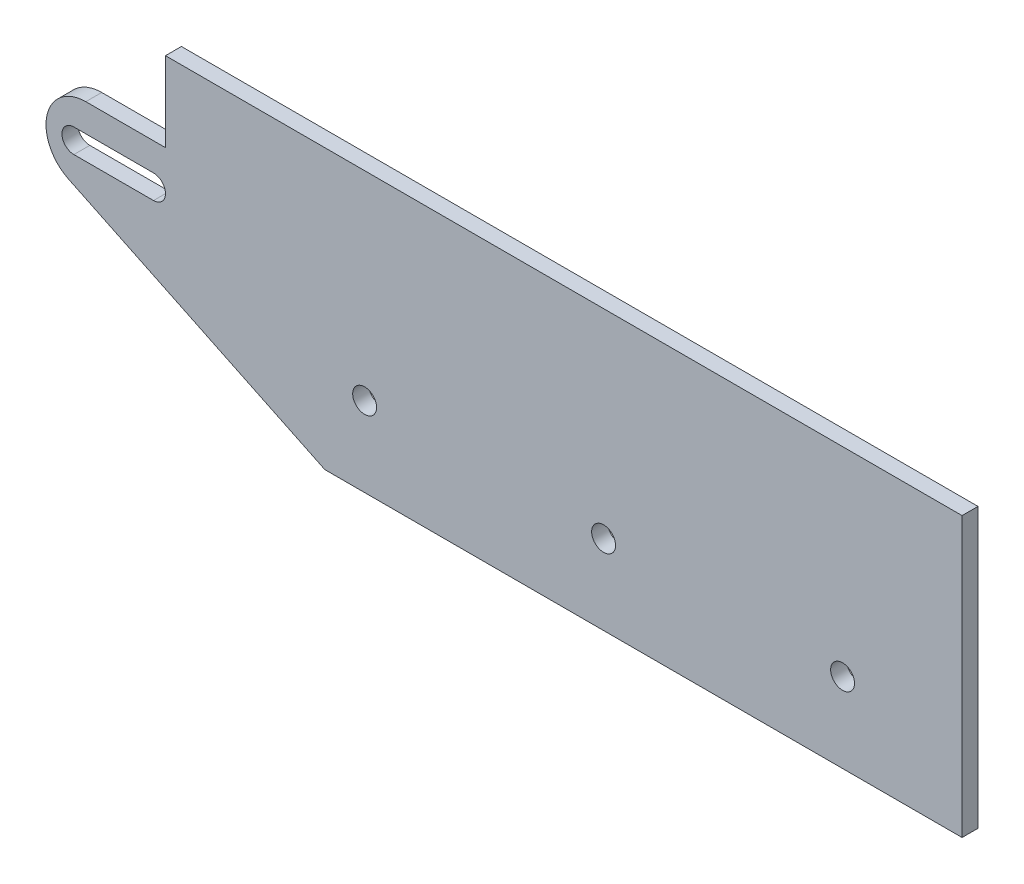
ISO-10303-21;
HEADER;
FILE_DESCRIPTION(('STEP AP214'),'2;1');
FILE_NAME('part.step','',(''),(''),'','','');
FILE_SCHEMA(('AUTOMOTIVE_DESIGN { 1 0 10303 214 1 1 1 1 }'));
ENDSEC;
DATA;
#1=APPLICATION_CONTEXT('core data for automotive mechanical design processes');
#2=APPLICATION_PROTOCOL_DEFINITION('international standard','automotive_design',2000,#1);
#3=PRODUCT_CONTEXT('',#1,'mechanical');
#4=PRODUCT('Part','Part','',(#3));
#5=PRODUCT_RELATED_PRODUCT_CATEGORY('part','',(#4));
#6=PRODUCT_DEFINITION_FORMATION('','',#4);
#7=PRODUCT_DEFINITION_CONTEXT('part definition',#1,'design');
#8=PRODUCT_DEFINITION('design','',#6,#7);
#9=PRODUCT_DEFINITION_SHAPE('','',#8);
#10=(LENGTH_UNIT() NAMED_UNIT(*) SI_UNIT(.MILLI.,.METRE.));
#11=(NAMED_UNIT(*) PLANE_ANGLE_UNIT() SI_UNIT($,.RADIAN.));
#12=(NAMED_UNIT(*) SI_UNIT($,.STERADIAN.) SOLID_ANGLE_UNIT());
#13=UNCERTAINTY_MEASURE_WITH_UNIT(LENGTH_MEASURE(1.E-05),#10,'distance_accuracy_value','');
#14=(GEOMETRIC_REPRESENTATION_CONTEXT(3) GLOBAL_UNCERTAINTY_ASSIGNED_CONTEXT((#13)) GLOBAL_UNIT_ASSIGNED_CONTEXT((#10,
#11,#12)) REPRESENTATION_CONTEXT('',''));
#15=CARTESIAN_POINT('',(0.,0.,0.));
#16=DIRECTION('',(0.,0.,1.));
#17=DIRECTION('',(1.,0.,0.));
#18=AXIS2_PLACEMENT_3D('',#15,#16,#17);
#19=CARTESIAN_POINT('',(-12.4914360624661,-25.9334108072672,2.));
#20=DIRECTION('',(-0.433956032964835,-0.900934049447252,0.));
#21=DIRECTION('',(0.900934049447252,-0.433956032964835,0.));
#22=AXIS2_PLACEMENT_3D('',#19,#20,#21);
#23=PLANE('',#22);
#24=DIRECTION('',(-0.900934049447252,0.433956032964835,0.));
#25=VECTOR('',#24,1.);
#26=CARTESIAN_POINT('',(-12.4914360624661,-25.9334108072672,0.));
#27=LINE('',#26,#25);
#28=CARTESIAN_POINT('',(-29.9999999999997,-17.5000000000002,0.));
#29=VERTEX_POINT('',#28);
#30=CARTESIAN_POINT('',(-62.1697801648241,-2.00467024723637,0.));
#31=VERTEX_POINT('',#30);
#32=EDGE_CURVE('E165',#29,#31,#27,.T.);
#33=ORIENTED_EDGE('',*,*,#32,.F.);
#34=DIRECTION('',(0.,0.,-1.));
#35=VECTOR('',#34,1.);
#36=CARTESIAN_POINT('',(-29.9999999999997,-17.5000000000002,2.));
#37=LINE('',#36,#35);
#38=CARTESIAN_POINT('',(-29.9999999999997,-17.5000000000002,2.));
#39=VERTEX_POINT('',#38);
#40=EDGE_CURVE('E11',#39,#29,#37,.T.);
#41=ORIENTED_EDGE('',*,*,#40,.F.);
#42=DIRECTION('',(-0.900934049447252,0.433956032964835,0.));
#43=VECTOR('',#42,1.);
#44=CARTESIAN_POINT('',(-12.4914360624661,-25.9334108072672,2.));
#45=LINE('',#44,#43);
#46=CARTESIAN_POINT('',(-62.1697801648241,-2.00467024723637,2.));
#47=VERTEX_POINT('',#46);
#48=EDGE_CURVE('E194',#39,#47,#45,.T.);
#49=ORIENTED_EDGE('',*,*,#48,.T.);
#50=DIRECTION('',(0.,0.,-1.));
#51=VECTOR('',#50,1.);
#52=CARTESIAN_POINT('',(-62.1697801648241,-2.00467024723637,2.));
#53=LINE('',#52,#51);
#54=EDGE_CURVE('E219',#47,#31,#53,.T.);
#55=ORIENTED_EDGE('',*,*,#54,.T.);
#56=EDGE_LOOP('',(#33,#41,#49,#55));
#57=FACE_BOUND('',#56,.T.);
#58=ADVANCED_FACE('F39',(#57),#23,.T.);
#59=CARTESIAN_POINT('',(0.,-17.5000000000002,2.));
#60=DIRECTION('',(0.,-1.,0.));
#61=DIRECTION('',(1.,0.,0.));
#62=AXIS2_PLACEMENT_3D('',#59,#60,#61);
#63=PLANE('',#62);
#64=DIRECTION('',(-1.,0.,0.));
#65=VECTOR('',#64,1.);
#66=CARTESIAN_POINT('',(0.,-17.5000000000002,0.));
#67=LINE('',#66,#65);
#68=CARTESIAN_POINT('',(50.,-17.5000000000001,0.));
#69=VERTEX_POINT('',#68);
#70=EDGE_CURVE('E223',#69,#29,#67,.T.);
#71=ORIENTED_EDGE('',*,*,#70,.F.);
#72=DIRECTION('',(0.,0.,-1.));
#73=VECTOR('',#72,1.);
#74=CARTESIAN_POINT('',(50.,-17.5000000000001,2.));
#75=LINE('',#74,#73);
#76=CARTESIAN_POINT('',(50.,-17.5000000000001,2.));
#77=VERTEX_POINT('',#76);
#78=EDGE_CURVE('E47',#77,#69,#75,.T.);
#79=ORIENTED_EDGE('',*,*,#78,.F.);
#80=DIRECTION('',(-1.,0.,0.));
#81=VECTOR('',#80,1.);
#82=CARTESIAN_POINT('',(0.,-17.5000000000002,2.));
#83=LINE('',#82,#81);
#84=EDGE_CURVE('E198',#77,#39,#83,.T.);
#85=ORIENTED_EDGE('',*,*,#84,.T.);
#86=ORIENTED_EDGE('',*,*,#40,.T.);
#87=EDGE_LOOP('',(#71,#79,#85,#86));
#88=FACE_BOUND('',#87,.T.);
#89=ADVANCED_FACE('F270',(#88),#63,.T.);
#90=CARTESIAN_POINT('',(50.,0.,2.));
#91=DIRECTION('',(-1.,0.,0.));
#92=DIRECTION('',(0.,0.,1.));
#93=AXIS2_PLACEMENT_3D('',#90,#91,#92);
#94=PLANE('',#93);
#95=DIRECTION('',(0.,1.,0.));
#96=VECTOR('',#95,1.);
#97=CARTESIAN_POINT('',(50.,0.,0.));
#98=LINE('',#97,#96);
#99=CARTESIAN_POINT('',(50.,17.4999999999999,0.));
#100=VERTEX_POINT('',#99);
#101=EDGE_CURVE('E227',#69,#100,#98,.T.);
#102=ORIENTED_EDGE('',*,*,#101,.T.);
#103=DIRECTION('',(0.,0.,-1.));
#104=VECTOR('',#103,1.);
#105=CARTESIAN_POINT('',(50.,17.4999999999999,2.));
#106=LINE('',#105,#104);
#107=CARTESIAN_POINT('',(50.,17.4999999999999,2.));
#108=VERTEX_POINT('',#107);
#109=EDGE_CURVE('E256',#108,#100,#106,.T.);
#110=ORIENTED_EDGE('',*,*,#109,.F.);
#111=DIRECTION('',(0.,1.,0.));
#112=VECTOR('',#111,1.);
#113=CARTESIAN_POINT('',(50.,0.,2.));
#114=LINE('',#113,#112);
#115=EDGE_CURVE('E203',#77,#108,#114,.T.);
#116=ORIENTED_EDGE('',*,*,#115,.F.);
#117=ORIENTED_EDGE('',*,*,#78,.T.);
#118=EDGE_LOOP('',(#102,#110,#116,#117));
#119=FACE_BOUND('',#118,.T.);
#120=ADVANCED_FACE('F263',(#119),#94,.F.);
#121=CARTESIAN_POINT('',(0.,17.4999999999999,2.));
#122=DIRECTION('',(0.,-1.,0.));
#123=DIRECTION('',(0.,0.,-1.));
#124=AXIS2_PLACEMENT_3D('',#121,#122,#123);
#125=PLANE('',#124);
#126=DIRECTION('',(-1.,0.,0.));
#127=VECTOR('',#126,1.);
#128=CARTESIAN_POINT('',(0.,17.4999999999999,0.));
#129=LINE('',#128,#127);
#130=CARTESIAN_POINT('',(-50.,17.4999999999999,0.));
#131=VERTEX_POINT('',#130);
#132=EDGE_CURVE('E230',#100,#131,#129,.T.);
#133=ORIENTED_EDGE('',*,*,#132,.T.);
#134=DIRECTION('',(0.,0.,-1.));
#135=VECTOR('',#134,1.);
#136=CARTESIAN_POINT('',(-50.,17.4999999999999,2.));
#137=LINE('',#136,#135);
#138=CARTESIAN_POINT('',(-50.,17.4999999999999,2.));
#139=VERTEX_POINT('',#138);
#140=EDGE_CURVE('E253',#139,#131,#137,.T.);
#141=ORIENTED_EDGE('',*,*,#140,.F.);
#142=DIRECTION('',(-1.,0.,0.));
#143=VECTOR('',#142,1.);
#144=CARTESIAN_POINT('',(0.,17.4999999999999,2.));
#145=LINE('',#144,#143);
#146=EDGE_CURVE('E206',#108,#139,#145,.T.);
#147=ORIENTED_EDGE('',*,*,#146,.F.);
#148=ORIENTED_EDGE('',*,*,#109,.T.);
#149=EDGE_LOOP('',(#133,#141,#147,#148));
#150=FACE_BOUND('',#149,.T.);
#151=ADVANCED_FACE('F291',(#150),#125,.F.);
#152=CARTESIAN_POINT('',(-49.9999999999998,-7.13714801544738E-13,2.));
#153=DIRECTION('',(-1.,0.,0.));
#154=DIRECTION('',(0.,-1.,0.));
#155=AXIS2_PLACEMENT_3D('',#152,#153,#154);
#156=PLANE('',#155);
#157=DIRECTION('',(0.,1.,0.));
#158=VECTOR('',#157,1.);
#159=CARTESIAN_POINT('',(-49.9999999999998,-7.13714801544738E-13,0.));
#160=LINE('',#159,#158);
#161=CARTESIAN_POINT('',(-49.9999999999999,7.49999999999989,0.));
#162=VERTEX_POINT('',#161);
#163=EDGE_CURVE('E234',#162,#131,#160,.T.);
#164=ORIENTED_EDGE('',*,*,#163,.F.);
#165=DIRECTION('',(0.,0.,-1.));
#166=VECTOR('',#165,1.);
#167=CARTESIAN_POINT('',(-49.9999999999999,7.49999999999989,2.));
#168=LINE('',#167,#166);
#169=CARTESIAN_POINT('',(-49.9999999999999,7.49999999999989,2.));
#170=VERTEX_POINT('',#169);
#171=EDGE_CURVE('E250',#170,#162,#168,.T.);
#172=ORIENTED_EDGE('',*,*,#171,.F.);
#173=DIRECTION('',(0.,1.,0.));
#174=VECTOR('',#173,1.);
#175=CARTESIAN_POINT('',(-49.9999999999998,-7.13714801544738E-13,2.));
#176=LINE('',#175,#174);
#177=EDGE_CURVE('E209',#170,#139,#176,.T.);
#178=ORIENTED_EDGE('',*,*,#177,.T.);
#179=ORIENTED_EDGE('',*,*,#140,.T.);
#180=EDGE_LOOP('',(#164,#172,#178,#179));
#181=FACE_BOUND('',#180,.T.);
#182=ADVANCED_FACE('F287',(#181),#156,.T.);
#183=CARTESIAN_POINT('',(0.,7.4999999999999,2.));
#184=DIRECTION('',(0.,-1.,0.));
#185=DIRECTION('',(1.,0.,0.));
#186=AXIS2_PLACEMENT_3D('',#183,#184,#185);
#187=PLANE('',#186);
#188=DIRECTION('',(-1.,0.,0.));
#189=VECTOR('',#188,1.);
#190=CARTESIAN_POINT('',(0.,7.4999999999999,0.));
#191=LINE('',#190,#189);
#192=CARTESIAN_POINT('',(-60.,7.49999999999989,0.));
#193=VERTEX_POINT('',#192);
#194=EDGE_CURVE('E238',#162,#193,#191,.T.);
#195=ORIENTED_EDGE('',*,*,#194,.T.);
#196=DIRECTION('',(0.,0.,-1.));
#197=VECTOR('',#196,1.);
#198=CARTESIAN_POINT('',(-60.,7.49999999999989,2.));
#199=LINE('',#198,#197);
#200=CARTESIAN_POINT('',(-60.,7.49999999999989,2.));
#201=VERTEX_POINT('',#200);
#202=EDGE_CURVE('E246',#201,#193,#199,.T.);
#203=ORIENTED_EDGE('',*,*,#202,.F.);
#204=DIRECTION('',(-1.,0.,0.));
#205=VECTOR('',#204,1.);
#206=CARTESIAN_POINT('',(0.,7.4999999999999,2.));
#207=LINE('',#206,#205);
#208=EDGE_CURVE('E213',#170,#201,#207,.T.);
#209=ORIENTED_EDGE('',*,*,#208,.F.);
#210=ORIENTED_EDGE('',*,*,#171,.T.);
#211=EDGE_LOOP('',(#195,#203,#209,#210));
#212=FACE_BOUND('',#211,.T.);
#213=ADVANCED_FACE('F284',(#212),#187,.F.);
#214=CARTESIAN_POINT('',(-60.,2.49999999999989,2.));
#215=DIRECTION('',(0.,0.,-1.));
#216=DIRECTION('',(-1.,0.,0.));
#217=AXIS2_PLACEMENT_3D('',#214,#215,#216);
#218=CYLINDRICAL_SURFACE('',#217,5.);
#219=CARTESIAN_POINT('',(-60.,2.49999999999989,0.));
#220=DIRECTION('',(0.,0.,1.));
#221=DIRECTION('',(1.,0.,0.));
#222=AXIS2_PLACEMENT_3D('',#219,#220,#221);
#223=CIRCLE('',#222,5.);
#224=EDGE_CURVE('E199',#193,#31,#223,.T.);
#225=ORIENTED_EDGE('',*,*,#224,.T.);
#226=ORIENTED_EDGE('',*,*,#54,.F.);
#227=CARTESIAN_POINT('',(-60.,2.49999999999989,2.));
#228=DIRECTION('',(0.,0.,1.));
#229=DIRECTION('',(1.,0.,0.));
#230=AXIS2_PLACEMENT_3D('',#227,#228,#229);
#231=CIRCLE('',#230,5.);
#232=EDGE_CURVE('E216',#201,#47,#231,.T.);
#233=ORIENTED_EDGE('',*,*,#232,.F.);
#234=ORIENTED_EDGE('',*,*,#202,.T.);
#235=EDGE_LOOP('',(#225,#226,#233,#234));
#236=FACE_BOUND('',#235,.T.);
#237=ADVANCED_FACE('F279',(#236),#218,.T.);
#238=CARTESIAN_POINT('',(0.,0.,2.));
#239=DIRECTION('',(0.,0.,1.));
#240=DIRECTION('',(1.,0.,0.));
#241=AXIS2_PLACEMENT_3D('',#238,#239,#240);
#242=PLANE('',#241);
#243=CARTESIAN_POINT('',(-51.5,2.49999999999989,2.));
#244=DIRECTION('',(0.,0.,1.));
#245=DIRECTION('',(1.,0.,0.));
#246=AXIS2_PLACEMENT_3D('',#243,#244,#245);
#247=CIRCLE('',#246,1.5);
#248=CARTESIAN_POINT('',(-51.5,0.999999999999889,2.));
#249=VERTEX_POINT('',#248);
#250=CARTESIAN_POINT('',(-51.5,3.9999999999999,2.));
#251=VERTEX_POINT('',#250);
#252=EDGE_CURVE('E54',#249,#251,#247,.T.);
#253=ORIENTED_EDGE('',*,*,#252,.F.);
#254=DIRECTION('',(1.,0.,0.));
#255=VECTOR('',#254,1.);
#256=CARTESIAN_POINT('',(0.,0.999999999999866,2.));
#257=LINE('',#256,#255);
#258=CARTESIAN_POINT('',(-61.5,0.999999999999891,2.));
#259=VERTEX_POINT('',#258);
#260=EDGE_CURVE('E142',#259,#249,#257,.T.);
#261=ORIENTED_EDGE('',*,*,#260,.F.);
#262=CARTESIAN_POINT('',(-61.5,2.49999999999989,2.));
#263=DIRECTION('',(0.,0.,1.));
#264=DIRECTION('',(1.,0.,0.));
#265=AXIS2_PLACEMENT_3D('',#262,#263,#264);
#266=CIRCLE('',#265,1.5);
#267=CARTESIAN_POINT('',(-61.5,3.9999999999999,2.));
#268=VERTEX_POINT('',#267);
#269=EDGE_CURVE('E146',#268,#259,#266,.T.);
#270=ORIENTED_EDGE('',*,*,#269,.F.);
#271=DIRECTION('',(1.,0.,0.));
#272=VECTOR('',#271,1.);
#273=CARTESIAN_POINT('',(0.,3.99999999999989,2.));
#274=LINE('',#273,#272);
#275=EDGE_CURVE('E155',#268,#251,#274,.T.);
#276=ORIENTED_EDGE('',*,*,#275,.T.);
#277=EDGE_LOOP('',(#253,#261,#270,#276));
#278=FACE_BOUND('',#277,.T.);
#279=CARTESIAN_POINT('',(5.00000000000005,-7.50000000000013,2.));
#280=DIRECTION('',(0.,0.,1.));
#281=DIRECTION('',(1.,0.,0.));
#282=AXIS2_PLACEMENT_3D('',#279,#280,#281);
#283=CIRCLE('',#282,1.5);
#284=CARTESIAN_POINT('',(6.50000000000005,-7.50000000000013,2.));
#285=VERTEX_POINT('',#284);
#286=EDGE_CURVE('E171',#285,#285,#283,.T.);
#287=ORIENTED_EDGE('',*,*,#286,.F.);
#288=EDGE_LOOP('',(#287));
#289=FACE_BOUND('',#288,.T.);
#290=CARTESIAN_POINT('',(35.,-7.50000000000013,2.));
#291=DIRECTION('',(0.,0.,1.));
#292=DIRECTION('',(1.,0.,0.));
#293=AXIS2_PLACEMENT_3D('',#290,#291,#292);
#294=CIRCLE('',#293,1.5);
#295=CARTESIAN_POINT('',(36.5,-7.50000000000013,2.));
#296=VERTEX_POINT('',#295);
#297=EDGE_CURVE('E187',#296,#296,#294,.T.);
#298=ORIENTED_EDGE('',*,*,#297,.F.);
#299=EDGE_LOOP('',(#298));
#300=FACE_BOUND('',#299,.T.);
#301=CARTESIAN_POINT('',(-25.,-7.50000000000013,2.));
#302=DIRECTION('',(0.,0.,1.));
#303=DIRECTION('',(1.,0.,0.));
#304=AXIS2_PLACEMENT_3D('',#301,#302,#303);
#305=CIRCLE('',#304,1.5);
#306=CARTESIAN_POINT('',(-23.5,-7.50000000000013,2.));
#307=VERTEX_POINT('',#306);
#308=EDGE_CURVE('E156',#307,#307,#305,.T.);
#309=ORIENTED_EDGE('',*,*,#308,.F.);
#310=EDGE_LOOP('',(#309));
#311=FACE_BOUND('',#310,.T.);
#312=ORIENTED_EDGE('',*,*,#48,.F.);
#313=ORIENTED_EDGE('',*,*,#84,.F.);
#314=ORIENTED_EDGE('',*,*,#115,.T.);
#315=ORIENTED_EDGE('',*,*,#146,.T.);
#316=ORIENTED_EDGE('',*,*,#177,.F.);
#317=ORIENTED_EDGE('',*,*,#208,.T.);
#318=ORIENTED_EDGE('',*,*,#232,.T.);
#319=EDGE_LOOP('',(#312,#313,#314,#315,#316,#317,#318));
#320=FACE_BOUND('',#319,.T.);
#321=ADVANCED_FACE('F293',(#278,#289,#300,#311,#320),#242,.T.);
#322=CARTESIAN_POINT('',(0.,0.,0.));
#323=DIRECTION('',(0.,0.,1.));
#324=DIRECTION('',(1.,0.,0.));
#325=AXIS2_PLACEMENT_3D('',#322,#323,#324);
#326=PLANE('',#325);
#327=DIRECTION('',(1.,0.,0.));
#328=VECTOR('',#327,1.);
#329=CARTESIAN_POINT('',(0.,0.999999999999866,0.));
#330=LINE('',#329,#328);
#331=CARTESIAN_POINT('',(-61.5,0.999999999999891,0.));
#332=VERTEX_POINT('',#331);
#333=CARTESIAN_POINT('',(-51.5,0.999999999999889,0.));
#334=VERTEX_POINT('',#333);
#335=EDGE_CURVE('E136',#332,#334,#330,.T.);
#336=ORIENTED_EDGE('',*,*,#335,.T.);
#337=CARTESIAN_POINT('',(-51.5,2.49999999999989,0.));
#338=DIRECTION('',(0.,0.,1.));
#339=DIRECTION('',(1.,0.,0.));
#340=AXIS2_PLACEMENT_3D('',#337,#338,#339);
#341=CIRCLE('',#340,1.5);
#342=CARTESIAN_POINT('',(-51.5,3.9999999999999,0.));
#343=VERTEX_POINT('',#342);
#344=EDGE_CURVE('E130',#334,#343,#341,.T.);
#345=ORIENTED_EDGE('',*,*,#344,.T.);
#346=DIRECTION('',(1.,0.,0.));
#347=VECTOR('',#346,1.);
#348=CARTESIAN_POINT('',(0.,3.99999999999989,0.));
#349=LINE('',#348,#347);
#350=CARTESIAN_POINT('',(-61.5,3.9999999999999,0.));
#351=VERTEX_POINT('',#350);
#352=EDGE_CURVE('E121',#351,#343,#349,.T.);
#353=ORIENTED_EDGE('',*,*,#352,.F.);
#354=CARTESIAN_POINT('',(-61.5,2.49999999999989,0.));
#355=DIRECTION('',(0.,0.,1.));
#356=DIRECTION('',(1.,0.,0.));
#357=AXIS2_PLACEMENT_3D('',#354,#355,#356);
#358=CIRCLE('',#357,1.5);
#359=EDGE_CURVE('E62',#351,#332,#358,.T.);
#360=ORIENTED_EDGE('',*,*,#359,.T.);
#361=EDGE_LOOP('',(#336,#345,#353,#360));
#362=FACE_BOUND('',#361,.T.);
#363=CARTESIAN_POINT('',(5.00000000000005,-7.50000000000013,0.));
#364=DIRECTION('',(0.,0.,1.));
#365=DIRECTION('',(1.,0.,0.));
#366=AXIS2_PLACEMENT_3D('',#363,#364,#365);
#367=CIRCLE('',#366,1.5);
#368=CARTESIAN_POINT('',(6.50000000000005,-7.50000000000013,0.));
#369=VERTEX_POINT('',#368);
#370=EDGE_CURVE('E176',#369,#369,#367,.T.);
#371=ORIENTED_EDGE('',*,*,#370,.T.);
#372=EDGE_LOOP('',(#371));
#373=FACE_BOUND('',#372,.T.);
#374=CARTESIAN_POINT('',(35.,-7.50000000000013,0.));
#375=DIRECTION('',(0.,0.,1.));
#376=DIRECTION('',(1.,0.,0.));
#377=AXIS2_PLACEMENT_3D('',#374,#375,#376);
#378=CIRCLE('',#377,1.5);
#379=CARTESIAN_POINT('',(36.5,-7.50000000000013,0.));
#380=VERTEX_POINT('',#379);
#381=EDGE_CURVE('E175',#380,#380,#378,.T.);
#382=ORIENTED_EDGE('',*,*,#381,.T.);
#383=EDGE_LOOP('',(#382));
#384=FACE_BOUND('',#383,.T.);
#385=CARTESIAN_POINT('',(-25.,-7.50000000000013,0.));
#386=DIRECTION('',(0.,0.,1.));
#387=DIRECTION('',(1.,0.,0.));
#388=AXIS2_PLACEMENT_3D('',#385,#386,#387);
#389=CIRCLE('',#388,1.5);
#390=CARTESIAN_POINT('',(-23.5,-7.50000000000013,0.));
#391=VERTEX_POINT('',#390);
#392=EDGE_CURVE('E183',#391,#391,#389,.T.);
#393=ORIENTED_EDGE('',*,*,#392,.T.);
#394=EDGE_LOOP('',(#393));
#395=FACE_BOUND('',#394,.T.);
#396=ORIENTED_EDGE('',*,*,#32,.T.);
#397=ORIENTED_EDGE('',*,*,#224,.F.);
#398=ORIENTED_EDGE('',*,*,#194,.F.);
#399=ORIENTED_EDGE('',*,*,#163,.T.);
#400=ORIENTED_EDGE('',*,*,#132,.F.);
#401=ORIENTED_EDGE('',*,*,#101,.F.);
#402=ORIENTED_EDGE('',*,*,#70,.T.);
#403=EDGE_LOOP('',(#396,#397,#398,#399,#400,#401,#402));
#404=FACE_BOUND('',#403,.T.);
#405=ADVANCED_FACE('F138',(#362,#373,#384,#395,#404),#326,.F.);
#406=CARTESIAN_POINT('',(-25.,-7.50000000000013,0.));
#407=DIRECTION('',(0.,0.,1.));
#408=DIRECTION('',(1.,0.,0.));
#409=AXIS2_PLACEMENT_3D('',#406,#407,#408);
#410=CYLINDRICAL_SURFACE('',#409,1.5);
#411=ORIENTED_EDGE('',*,*,#392,.F.);
#412=EDGE_LOOP('',(#411));
#413=FACE_BOUND('',#412,.T.);
#414=ORIENTED_EDGE('',*,*,#308,.T.);
#415=EDGE_LOOP('',(#414));
#416=FACE_BOUND('',#415,.T.);
#417=ADVANCED_FACE('F301',(#413,#416),#410,.F.);
#418=CARTESIAN_POINT('',(35.,-7.50000000000013,0.));
#419=DIRECTION('',(0.,0.,1.));
#420=DIRECTION('',(1.,0.,0.));
#421=AXIS2_PLACEMENT_3D('',#418,#419,#420);
#422=CYLINDRICAL_SURFACE('',#421,1.5);
#423=ORIENTED_EDGE('',*,*,#381,.F.);
#424=EDGE_LOOP('',(#423));
#425=FACE_BOUND('',#424,.T.);
#426=ORIENTED_EDGE('',*,*,#297,.T.);
#427=EDGE_LOOP('',(#426));
#428=FACE_BOUND('',#427,.T.);
#429=ADVANCED_FACE('F351',(#425,#428),#422,.F.);
#430=CARTESIAN_POINT('',(5.00000000000005,-7.50000000000013,0.));
#431=DIRECTION('',(0.,0.,1.));
#432=DIRECTION('',(1.,0.,0.));
#433=AXIS2_PLACEMENT_3D('',#430,#431,#432);
#434=CYLINDRICAL_SURFACE('',#433,1.5);
#435=ORIENTED_EDGE('',*,*,#370,.F.);
#436=EDGE_LOOP('',(#435));
#437=FACE_BOUND('',#436,.T.);
#438=ORIENTED_EDGE('',*,*,#286,.T.);
#439=EDGE_LOOP('',(#438));
#440=FACE_BOUND('',#439,.T.);
#441=ADVANCED_FACE('F361',(#437,#440),#434,.F.);
#442=CARTESIAN_POINT('',(-51.5,2.49999999999989,0.));
#443=DIRECTION('',(0.,0.,1.));
#444=DIRECTION('',(1.,0.,0.));
#445=AXIS2_PLACEMENT_3D('',#442,#443,#444);
#446=CYLINDRICAL_SURFACE('',#445,1.5);
#447=ORIENTED_EDGE('',*,*,#252,.T.);
#448=DIRECTION('',(0.,0.,1.));
#449=VECTOR('',#448,1.);
#450=CARTESIAN_POINT('',(-51.5,3.9999999999999,0.));
#451=LINE('',#450,#449);
#452=EDGE_CURVE('E124',#343,#251,#451,.T.);
#453=ORIENTED_EDGE('',*,*,#452,.F.);
#454=ORIENTED_EDGE('',*,*,#344,.F.);
#455=DIRECTION('',(0.,0.,1.));
#456=VECTOR('',#455,1.);
#457=CARTESIAN_POINT('',(-51.5,0.999999999999889,0.));
#458=LINE('',#457,#456);
#459=EDGE_CURVE('E162',#334,#249,#458,.T.);
#460=ORIENTED_EDGE('',*,*,#459,.T.);
#461=EDGE_LOOP('',(#447,#453,#454,#460));
#462=FACE_BOUND('',#461,.T.);
#463=ADVANCED_FACE('F133',(#462),#446,.F.);
#464=CARTESIAN_POINT('',(0.,0.999999999999866,0.));
#465=DIRECTION('',(0.,-1.,0.));
#466=DIRECTION('',(1.,0.,0.));
#467=AXIS2_PLACEMENT_3D('',#464,#465,#466);
#468=PLANE('',#467);
#469=ORIENTED_EDGE('',*,*,#260,.T.);
#470=ORIENTED_EDGE('',*,*,#459,.F.);
#471=ORIENTED_EDGE('',*,*,#335,.F.);
#472=DIRECTION('',(0.,0.,1.));
#473=VECTOR('',#472,1.);
#474=CARTESIAN_POINT('',(-61.5,0.999999999999891,0.));
#475=LINE('',#474,#473);
#476=EDGE_CURVE('E166',#332,#259,#475,.T.);
#477=ORIENTED_EDGE('',*,*,#476,.T.);
#478=EDGE_LOOP('',(#469,#470,#471,#477));
#479=FACE_BOUND('',#478,.T.);
#480=ADVANCED_FACE('F379',(#479),#468,.F.);
#481=CARTESIAN_POINT('',(-61.5,2.49999999999989,0.));
#482=DIRECTION('',(0.,0.,1.));
#483=DIRECTION('',(1.,0.,0.));
#484=AXIS2_PLACEMENT_3D('',#481,#482,#483);
#485=CYLINDRICAL_SURFACE('',#484,1.5);
#486=ORIENTED_EDGE('',*,*,#269,.T.);
#487=ORIENTED_EDGE('',*,*,#476,.F.);
#488=ORIENTED_EDGE('',*,*,#359,.F.);
#489=DIRECTION('',(0.,0.,1.));
#490=VECTOR('',#489,1.);
#491=CARTESIAN_POINT('',(-61.5,3.9999999999999,0.));
#492=LINE('',#491,#490);
#493=EDGE_CURVE('E126',#351,#268,#492,.T.);
#494=ORIENTED_EDGE('',*,*,#493,.T.);
#495=EDGE_LOOP('',(#486,#487,#488,#494));
#496=FACE_BOUND('',#495,.T.);
#497=ADVANCED_FACE('F388',(#496),#485,.F.);
#498=CARTESIAN_POINT('',(0.,3.99999999999989,0.));
#499=DIRECTION('',(0.,-1.,0.));
#500=DIRECTION('',(1.,0.,0.));
#501=AXIS2_PLACEMENT_3D('',#498,#499,#500);
#502=PLANE('',#501);
#503=ORIENTED_EDGE('',*,*,#275,.F.);
#504=ORIENTED_EDGE('',*,*,#493,.F.);
#505=ORIENTED_EDGE('',*,*,#352,.T.);
#506=ORIENTED_EDGE('',*,*,#452,.T.);
#507=EDGE_LOOP('',(#503,#504,#505,#506));
#508=FACE_BOUND('',#507,.T.);
#509=ADVANCED_FACE('F123',(#508),#502,.T.);
#510=CLOSED_SHELL('',(#58,#89,#120,#151,#182,#213,#237,#321,#405,#417,#429,#441,#463,#480,#497,#509));
#511=MANIFOLD_SOLID_BREP('B2',#510);
#512=ADVANCED_BREP_SHAPE_REPRESENTATION('',(#18,#511),#14);
#513=SHAPE_DEFINITION_REPRESENTATION(#9,#512);
ENDSEC;
END-ISO-10303-21;
